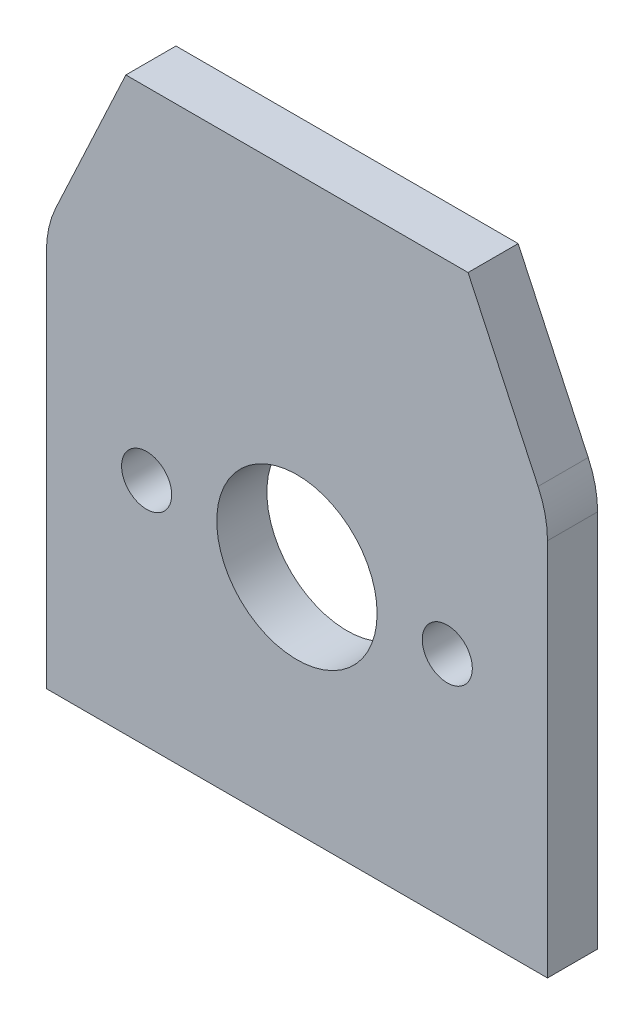
ISO-10303-21;
HEADER;
FILE_DESCRIPTION(('STEP AP214'),'2;1');
FILE_NAME('part.step','',(''),(''),'','','');
FILE_SCHEMA(('AUTOMOTIVE_DESIGN { 1 0 10303 214 1 1 1 1 }'));
ENDSEC;
DATA;
#1=APPLICATION_CONTEXT('core data for automotive mechanical design processes');
#2=APPLICATION_PROTOCOL_DEFINITION('international standard','automotive_design',2000,#1);
#3=PRODUCT_CONTEXT('',#1,'mechanical');
#4=PRODUCT('Part','Part','',(#3));
#5=PRODUCT_RELATED_PRODUCT_CATEGORY('part','',(#4));
#6=PRODUCT_DEFINITION_FORMATION('','',#4);
#7=PRODUCT_DEFINITION_CONTEXT('part definition',#1,'design');
#8=PRODUCT_DEFINITION('design','',#6,#7);
#9=PRODUCT_DEFINITION_SHAPE('','',#8);
#10=(LENGTH_UNIT() NAMED_UNIT(*) SI_UNIT(.MILLI.,.METRE.));
#11=(NAMED_UNIT(*) PLANE_ANGLE_UNIT() SI_UNIT($,.RADIAN.));
#12=(NAMED_UNIT(*) SI_UNIT($,.STERADIAN.) SOLID_ANGLE_UNIT());
#13=UNCERTAINTY_MEASURE_WITH_UNIT(LENGTH_MEASURE(1.E-05),#10,'distance_accuracy_value','');
#14=(GEOMETRIC_REPRESENTATION_CONTEXT(3) GLOBAL_UNCERTAINTY_ASSIGNED_CONTEXT((#13)) GLOBAL_UNIT_ASSIGNED_CONTEXT((#10,
#11,#12)) REPRESENTATION_CONTEXT('',''));
#15=CARTESIAN_POINT('',(0.,0.,0.));
#16=DIRECTION('',(0.,0.,1.));
#17=DIRECTION('',(1.,0.,0.));
#18=AXIS2_PLACEMENT_3D('',#15,#16,#17);
#19=CARTESIAN_POINT('',(15.,37.7830533735706,2.5));
#20=DIRECTION('',(0.,0.,1.));
#21=DIRECTION('',(1.,0.,0.));
#22=AXIS2_PLACEMENT_3D('',#19,#20,#21);
#23=PLANE('',#22);
#24=CARTESIAN_POINT('',(-15.,23.,2.5));
#25=DIRECTION('',(0.,0.,1.));
#26=DIRECTION('',(1.,0.,0.));
#27=AXIS2_PLACEMENT_3D('',#24,#25,#26);
#28=CIRCLE('',#27,2.5);
#29=CARTESIAN_POINT('',(-12.5,23.,2.5));
#30=VERTEX_POINT('',#29);
#31=EDGE_CURVE('E192',#30,#30,#28,.T.);
#32=ORIENTED_EDGE('',*,*,#31,.F.);
#33=EDGE_LOOP('',(#32));
#34=FACE_BOUND('',#33,.T.);
#35=DIRECTION('',(1.,0.,0.));
#36=VECTOR('',#35,1.);
#37=CARTESIAN_POINT('',(-25.,0.,2.5));
#38=LINE('',#37,#36);
#39=CARTESIAN_POINT('',(-25.,0.,2.5));
#40=VERTEX_POINT('',#39);
#41=CARTESIAN_POINT('',(25.,0.,2.5));
#42=VERTEX_POINT('',#41);
#43=EDGE_CURVE('E155',#40,#42,#38,.T.);
#44=ORIENTED_EDGE('',*,*,#43,.T.);
#45=DIRECTION('',(0.,1.,0.));
#46=VECTOR('',#45,1.);
#47=CARTESIAN_POINT('',(25.,0.,2.5));
#48=LINE('',#47,#46);
#49=CARTESIAN_POINT('',(25.,37.7830533735706,2.5));
#50=VERTEX_POINT('',#49);
#51=EDGE_CURVE('E103',#42,#50,#48,.T.);
#52=ORIENTED_EDGE('',*,*,#51,.T.);
#53=CARTESIAN_POINT('',(15.,37.7830533735706,2.5));
#54=DIRECTION('',(0.,0.,1.));
#55=DIRECTION('',(1.,0.,0.));
#56=AXIS2_PLACEMENT_3D('',#53,#54,#55);
#57=CIRCLE('',#56,10.);
#58=CARTESIAN_POINT('',(24.0630778703665,42.0092359909776,2.5));
#59=VERTEX_POINT('',#58);
#60=EDGE_CURVE('E170',#50,#59,#57,.T.);
#61=ORIENTED_EDGE('',*,*,#60,.T.);
#62=DIRECTION('',(-0.4226182617407,0.90630778703665,0.));
#63=VECTOR('',#62,1.);
#64=CARTESIAN_POINT('',(24.0630778703665,42.0092359909776,2.5));
#65=LINE('',#64,#63);
#66=CARTESIAN_POINT('',(17.072769811365,57.,2.5));
#67=VERTEX_POINT('',#66);
#68=EDGE_CURVE('E183',#59,#67,#65,.T.);
#69=ORIENTED_EDGE('',*,*,#68,.T.);
#70=DIRECTION('',(-1.,0.,0.));
#71=VECTOR('',#70,1.);
#72=CARTESIAN_POINT('',(-17.072769811365,57.,2.5));
#73=LINE('',#72,#71);
#74=CARTESIAN_POINT('',(-17.072769811365,57.,2.5));
#75=VERTEX_POINT('',#74);
#76=EDGE_CURVE('E122',#67,#75,#73,.T.);
#77=ORIENTED_EDGE('',*,*,#76,.T.);
#78=DIRECTION('',(-0.4226182617407,-0.90630778703665,0.));
#79=VECTOR('',#78,1.);
#80=CARTESIAN_POINT('',(-24.0630778703665,42.0092359909776,2.5));
#81=LINE('',#80,#79);
#82=CARTESIAN_POINT('',(-24.0630778703665,42.0092359909776,2.5));
#83=VERTEX_POINT('',#82);
#84=EDGE_CURVE('E116',#75,#83,#81,.T.);
#85=ORIENTED_EDGE('',*,*,#84,.T.);
#86=CARTESIAN_POINT('',(-15.,37.7830533735706,2.5));
#87=DIRECTION('',(0.,0.,1.));
#88=DIRECTION('',(-1.,0.,0.));
#89=AXIS2_PLACEMENT_3D('',#86,#87,#88);
#90=CIRCLE('',#89,10.);
#91=CARTESIAN_POINT('',(-25.,37.7830533735706,2.5));
#92=VERTEX_POINT('',#91);
#93=EDGE_CURVE('E120',#83,#92,#90,.T.);
#94=ORIENTED_EDGE('',*,*,#93,.T.);
#95=DIRECTION('',(0.,-1.,0.));
#96=VECTOR('',#95,1.);
#97=CARTESIAN_POINT('',(-25.,0.,2.5));
#98=LINE('',#97,#96);
#99=EDGE_CURVE('E60',#92,#40,#98,.T.);
#100=ORIENTED_EDGE('',*,*,#99,.T.);
#101=EDGE_LOOP('',(#44,#52,#61,#69,#77,#85,#94,#100));
#102=FACE_BOUND('',#101,.T.);
#103=CARTESIAN_POINT('',(0.,23.,2.5));
#104=DIRECTION('',(0.,0.,1.));
#105=DIRECTION('',(1.,0.,0.));
#106=AXIS2_PLACEMENT_3D('',#103,#104,#105);
#107=CIRCLE('',#106,8.);
#108=CARTESIAN_POINT('',(8.,23.,2.5));
#109=VERTEX_POINT('',#108);
#110=EDGE_CURVE('E144',#109,#109,#107,.T.);
#111=ORIENTED_EDGE('',*,*,#110,.F.);
#112=EDGE_LOOP('',(#111));
#113=FACE_BOUND('',#112,.T.);
#114=CARTESIAN_POINT('',(15.,23.,2.5));
#115=DIRECTION('',(0.,0.,1.));
#116=DIRECTION('',(1.,0.,0.));
#117=AXIS2_PLACEMENT_3D('',#114,#115,#116);
#118=CIRCLE('',#117,2.5);
#119=CARTESIAN_POINT('',(17.5,23.,2.5));
#120=VERTEX_POINT('',#119);
#121=EDGE_CURVE('E198',#120,#120,#118,.T.);
#122=ORIENTED_EDGE('',*,*,#121,.F.);
#123=EDGE_LOOP('',(#122));
#124=FACE_BOUND('',#123,.T.);
#125=ADVANCED_FACE('F43',(#34,#102,#113,#124),#23,.T.);
#126=CARTESIAN_POINT('',(15.,37.7830533735706,-2.5));
#127=DIRECTION('',(0.,0.,1.));
#128=DIRECTION('',(1.,0.,0.));
#129=AXIS2_PLACEMENT_3D('',#126,#127,#128);
#130=PLANE('',#129);
#131=DIRECTION('',(1.,0.,0.));
#132=VECTOR('',#131,1.);
#133=CARTESIAN_POINT('',(-25.,0.,-2.5));
#134=LINE('',#133,#132);
#135=CARTESIAN_POINT('',(-25.,0.,-2.5));
#136=VERTEX_POINT('',#135);
#137=CARTESIAN_POINT('',(25.,0.,-2.5));
#138=VERTEX_POINT('',#137);
#139=EDGE_CURVE('E140',#136,#138,#134,.T.);
#140=ORIENTED_EDGE('',*,*,#139,.F.);
#141=DIRECTION('',(0.,-1.,0.));
#142=VECTOR('',#141,1.);
#143=CARTESIAN_POINT('',(-25.,0.,-2.5));
#144=LINE('',#143,#142);
#145=CARTESIAN_POINT('',(-25.,37.7830533735706,-2.5));
#146=VERTEX_POINT('',#145);
#147=EDGE_CURVE('E95',#146,#136,#144,.T.);
#148=ORIENTED_EDGE('',*,*,#147,.F.);
#149=CARTESIAN_POINT('',(-15.,37.7830533735706,-2.5));
#150=DIRECTION('',(0.,0.,1.));
#151=DIRECTION('',(-1.,0.,0.));
#152=AXIS2_PLACEMENT_3D('',#149,#150,#151);
#153=CIRCLE('',#152,10.);
#154=CARTESIAN_POINT('',(-24.0630778703665,42.0092359909776,-2.5));
#155=VERTEX_POINT('',#154);
#156=EDGE_CURVE('E89',#155,#146,#153,.T.);
#157=ORIENTED_EDGE('',*,*,#156,.F.);
#158=DIRECTION('',(-0.4226182617407,-0.90630778703665,0.));
#159=VECTOR('',#158,1.);
#160=CARTESIAN_POINT('',(-24.0630778703665,42.0092359909776,-2.5));
#161=LINE('',#160,#159);
#162=CARTESIAN_POINT('',(-17.072769811365,57.,-2.5));
#163=VERTEX_POINT('',#162);
#164=EDGE_CURVE('E130',#163,#155,#161,.T.);
#165=ORIENTED_EDGE('',*,*,#164,.F.);
#166=DIRECTION('',(-1.,0.,0.));
#167=VECTOR('',#166,1.);
#168=CARTESIAN_POINT('',(-17.072769811365,57.,-2.5));
#169=LINE('',#168,#167);
#170=CARTESIAN_POINT('',(17.072769811365,57.,-2.5));
#171=VERTEX_POINT('',#170);
#172=EDGE_CURVE('E150',#171,#163,#169,.T.);
#173=ORIENTED_EDGE('',*,*,#172,.F.);
#174=DIRECTION('',(-0.4226182617407,0.90630778703665,0.));
#175=VECTOR('',#174,1.);
#176=CARTESIAN_POINT('',(24.0630778703665,42.0092359909776,-2.5));
#177=LINE('',#176,#175);
#178=CARTESIAN_POINT('',(24.0630778703665,42.0092359909776,-2.5));
#179=VERTEX_POINT('',#178);
#180=EDGE_CURVE('E148',#179,#171,#177,.T.);
#181=ORIENTED_EDGE('',*,*,#180,.F.);
#182=CARTESIAN_POINT('',(15.,37.7830533735706,-2.5));
#183=DIRECTION('',(0.,0.,1.));
#184=DIRECTION('',(1.,0.,0.));
#185=AXIS2_PLACEMENT_3D('',#182,#183,#184);
#186=CIRCLE('',#185,10.);
#187=CARTESIAN_POINT('',(25.,37.7830533735706,-2.5));
#188=VERTEX_POINT('',#187);
#189=EDGE_CURVE('E146',#188,#179,#186,.T.);
#190=ORIENTED_EDGE('',*,*,#189,.F.);
#191=DIRECTION('',(0.,1.,0.));
#192=VECTOR('',#191,1.);
#193=CARTESIAN_POINT('',(25.,0.,-2.5));
#194=LINE('',#193,#192);
#195=EDGE_CURVE('E143',#138,#188,#194,.T.);
#196=ORIENTED_EDGE('',*,*,#195,.F.);
#197=EDGE_LOOP('',(#140,#148,#157,#165,#173,#181,#190,#196));
#198=FACE_BOUND('',#197,.T.);
#199=CARTESIAN_POINT('',(0.,23.,-2.5));
#200=DIRECTION('',(0.,0.,1.));
#201=DIRECTION('',(1.,0.,0.));
#202=AXIS2_PLACEMENT_3D('',#199,#200,#201);
#203=CIRCLE('',#202,8.);
#204=CARTESIAN_POINT('',(8.,23.,-2.5));
#205=VERTEX_POINT('',#204);
#206=EDGE_CURVE('E189',#205,#205,#203,.T.);
#207=ORIENTED_EDGE('',*,*,#206,.T.);
#208=EDGE_LOOP('',(#207));
#209=FACE_BOUND('',#208,.T.);
#210=CARTESIAN_POINT('',(-15.,23.,-2.5));
#211=DIRECTION('',(0.,0.,1.));
#212=DIRECTION('',(1.,0.,0.));
#213=AXIS2_PLACEMENT_3D('',#210,#211,#212);
#214=CIRCLE('',#213,2.5);
#215=CARTESIAN_POINT('',(-12.5,23.,-2.5));
#216=VERTEX_POINT('',#215);
#217=EDGE_CURVE('E195',#216,#216,#214,.T.);
#218=ORIENTED_EDGE('',*,*,#217,.T.);
#219=EDGE_LOOP('',(#218));
#220=FACE_BOUND('',#219,.T.);
#221=CARTESIAN_POINT('',(15.,23.,-2.5));
#222=DIRECTION('',(0.,0.,1.));
#223=DIRECTION('',(1.,0.,0.));
#224=AXIS2_PLACEMENT_3D('',#221,#222,#223);
#225=CIRCLE('',#224,2.5);
#226=CARTESIAN_POINT('',(17.5,23.,-2.5));
#227=VERTEX_POINT('',#226);
#228=EDGE_CURVE('E201',#227,#227,#225,.T.);
#229=ORIENTED_EDGE('',*,*,#228,.T.);
#230=EDGE_LOOP('',(#229));
#231=FACE_BOUND('',#230,.T.);
#232=ADVANCED_FACE('F174',(#198,#209,#220,#231),#130,.F.);
#233=CARTESIAN_POINT('',(-25.,0.,2.5));
#234=DIRECTION('',(0.,1.,0.));
#235=DIRECTION('',(0.,0.,1.));
#236=AXIS2_PLACEMENT_3D('',#233,#234,#235);
#237=PLANE('',#236);
#238=ORIENTED_EDGE('',*,*,#139,.T.);
#239=DIRECTION('',(0.,0.,-1.));
#240=VECTOR('',#239,1.);
#241=CARTESIAN_POINT('',(25.,0.,2.5));
#242=LINE('',#241,#240);
#243=EDGE_CURVE('E11',#42,#138,#242,.T.);
#244=ORIENTED_EDGE('',*,*,#243,.F.);
#245=ORIENTED_EDGE('',*,*,#43,.F.);
#246=DIRECTION('',(0.,0.,-1.));
#247=VECTOR('',#246,1.);
#248=CARTESIAN_POINT('',(-25.,0.,2.5));
#249=LINE('',#248,#247);
#250=EDGE_CURVE('E136',#40,#136,#249,.T.);
#251=ORIENTED_EDGE('',*,*,#250,.T.);
#252=EDGE_LOOP('',(#238,#244,#245,#251));
#253=FACE_BOUND('',#252,.T.);
#254=ADVANCED_FACE('F45',(#253),#237,.F.);
#255=CARTESIAN_POINT('',(25.,0.,2.5));
#256=DIRECTION('',(-1.,0.,0.));
#257=DIRECTION('',(0.,-1.,0.));
#258=AXIS2_PLACEMENT_3D('',#255,#256,#257);
#259=PLANE('',#258);
#260=ORIENTED_EDGE('',*,*,#195,.T.);
#261=DIRECTION('',(0.,0.,-1.));
#262=VECTOR('',#261,1.);
#263=CARTESIAN_POINT('',(25.,37.7830533735706,2.5));
#264=LINE('',#263,#262);
#265=EDGE_CURVE('E52',#50,#188,#264,.T.);
#266=ORIENTED_EDGE('',*,*,#265,.F.);
#267=ORIENTED_EDGE('',*,*,#51,.F.);
#268=ORIENTED_EDGE('',*,*,#243,.T.);
#269=EDGE_LOOP('',(#260,#266,#267,#268));
#270=FACE_BOUND('',#269,.T.);
#271=ADVANCED_FACE('F234',(#270),#259,.F.);
#272=CARTESIAN_POINT('',(15.,37.7830533735706,2.5));
#273=DIRECTION('',(0.,0.,-1.));
#274=DIRECTION('',(-1.,0.,0.));
#275=AXIS2_PLACEMENT_3D('',#272,#273,#274);
#276=CYLINDRICAL_SURFACE('',#275,10.);
#277=ORIENTED_EDGE('',*,*,#189,.T.);
#278=DIRECTION('',(0.,0.,-1.));
#279=VECTOR('',#278,1.);
#280=CARTESIAN_POINT('',(24.0630778703665,42.0092359909776,2.5));
#281=LINE('',#280,#279);
#282=EDGE_CURVE('E162',#59,#179,#281,.T.);
#283=ORIENTED_EDGE('',*,*,#282,.F.);
#284=ORIENTED_EDGE('',*,*,#60,.F.);
#285=ORIENTED_EDGE('',*,*,#265,.T.);
#286=EDGE_LOOP('',(#277,#283,#284,#285));
#287=FACE_BOUND('',#286,.T.);
#288=ADVANCED_FACE('F168',(#287),#276,.T.);
#289=CARTESIAN_POINT('',(24.0630778703665,42.0092359909776,2.5));
#290=DIRECTION('',(-0.90630778703665,-0.4226182617407,0.));
#291=DIRECTION('',(0.4226182617407,-0.90630778703665,0.));
#292=AXIS2_PLACEMENT_3D('',#289,#290,#291);
#293=PLANE('',#292);
#294=ORIENTED_EDGE('',*,*,#180,.T.);
#295=DIRECTION('',(0.,0.,-1.));
#296=VECTOR('',#295,1.);
#297=CARTESIAN_POINT('',(17.072769811365,57.,2.5));
#298=LINE('',#297,#296);
#299=EDGE_CURVE('E159',#67,#171,#298,.T.);
#300=ORIENTED_EDGE('',*,*,#299,.F.);
#301=ORIENTED_EDGE('',*,*,#68,.F.);
#302=ORIENTED_EDGE('',*,*,#282,.T.);
#303=EDGE_LOOP('',(#294,#300,#301,#302));
#304=FACE_BOUND('',#303,.T.);
#305=ADVANCED_FACE('F179',(#304),#293,.F.);
#306=CARTESIAN_POINT('',(-17.072769811365,57.,2.5));
#307=DIRECTION('',(0.,-1.,0.));
#308=DIRECTION('',(0.,0.,-1.));
#309=AXIS2_PLACEMENT_3D('',#306,#307,#308);
#310=PLANE('',#309);
#311=ORIENTED_EDGE('',*,*,#172,.T.);
#312=DIRECTION('',(0.,0.,-1.));
#313=VECTOR('',#312,1.);
#314=CARTESIAN_POINT('',(-17.072769811365,57.,2.5));
#315=LINE('',#314,#313);
#316=EDGE_CURVE('E131',#75,#163,#315,.T.);
#317=ORIENTED_EDGE('',*,*,#316,.F.);
#318=ORIENTED_EDGE('',*,*,#76,.F.);
#319=ORIENTED_EDGE('',*,*,#299,.T.);
#320=EDGE_LOOP('',(#311,#317,#318,#319));
#321=FACE_BOUND('',#320,.T.);
#322=ADVANCED_FACE('F182',(#321),#310,.F.);
#323=CARTESIAN_POINT('',(-24.0630778703665,42.0092359909776,2.5));
#324=DIRECTION('',(0.90630778703665,-0.4226182617407,0.));
#325=DIRECTION('',(0.4226182617407,0.90630778703665,0.));
#326=AXIS2_PLACEMENT_3D('',#323,#324,#325);
#327=PLANE('',#326);
#328=ORIENTED_EDGE('',*,*,#164,.T.);
#329=DIRECTION('',(0.,0.,-1.));
#330=VECTOR('',#329,1.);
#331=CARTESIAN_POINT('',(-24.0630778703665,42.0092359909776,2.5));
#332=LINE('',#331,#330);
#333=EDGE_CURVE('E127',#83,#155,#332,.T.);
#334=ORIENTED_EDGE('',*,*,#333,.F.);
#335=ORIENTED_EDGE('',*,*,#84,.F.);
#336=ORIENTED_EDGE('',*,*,#316,.T.);
#337=EDGE_LOOP('',(#328,#334,#335,#336));
#338=FACE_BOUND('',#337,.T.);
#339=ADVANCED_FACE('F128',(#338),#327,.F.);
#340=CARTESIAN_POINT('',(-15.,37.7830533735706,2.5));
#341=DIRECTION('',(0.,0.,-1.));
#342=DIRECTION('',(-1.,0.,0.));
#343=AXIS2_PLACEMENT_3D('',#340,#341,#342);
#344=CYLINDRICAL_SURFACE('',#343,10.);
#345=ORIENTED_EDGE('',*,*,#156,.T.);
#346=DIRECTION('',(0.,0.,-1.));
#347=VECTOR('',#346,1.);
#348=CARTESIAN_POINT('',(-25.,37.7830533735706,2.5));
#349=LINE('',#348,#347);
#350=EDGE_CURVE('E132',#92,#146,#349,.T.);
#351=ORIENTED_EDGE('',*,*,#350,.F.);
#352=ORIENTED_EDGE('',*,*,#93,.F.);
#353=ORIENTED_EDGE('',*,*,#333,.T.);
#354=EDGE_LOOP('',(#345,#351,#352,#353));
#355=FACE_BOUND('',#354,.T.);
#356=ADVANCED_FACE('F134',(#355),#344,.T.);
#357=CARTESIAN_POINT('',(-25.,0.,2.5));
#358=DIRECTION('',(1.,0.,0.));
#359=DIRECTION('',(0.,1.,0.));
#360=AXIS2_PLACEMENT_3D('',#357,#358,#359);
#361=PLANE('',#360);
#362=ORIENTED_EDGE('',*,*,#147,.T.);
#363=ORIENTED_EDGE('',*,*,#250,.F.);
#364=ORIENTED_EDGE('',*,*,#99,.F.);
#365=ORIENTED_EDGE('',*,*,#350,.T.);
#366=EDGE_LOOP('',(#362,#363,#364,#365));
#367=FACE_BOUND('',#366,.T.);
#368=ADVANCED_FACE('F222',(#367),#361,.F.);
#369=CARTESIAN_POINT('',(0.,23.,2.5));
#370=DIRECTION('',(0.,0.,-1.));
#371=DIRECTION('',(-1.,0.,0.));
#372=AXIS2_PLACEMENT_3D('',#369,#370,#371);
#373=CYLINDRICAL_SURFACE('',#372,8.);
#374=ORIENTED_EDGE('',*,*,#110,.T.);
#375=EDGE_LOOP('',(#374));
#376=FACE_BOUND('',#375,.T.);
#377=ORIENTED_EDGE('',*,*,#206,.F.);
#378=EDGE_LOOP('',(#377));
#379=FACE_BOUND('',#378,.T.);
#380=ADVANCED_FACE('F219',(#376,#379),#373,.F.);
#381=CARTESIAN_POINT('',(-15.,23.,2.5));
#382=DIRECTION('',(0.,0.,-1.));
#383=DIRECTION('',(-1.,0.,0.));
#384=AXIS2_PLACEMENT_3D('',#381,#382,#383);
#385=CYLINDRICAL_SURFACE('',#384,2.5);
#386=ORIENTED_EDGE('',*,*,#31,.T.);
#387=EDGE_LOOP('',(#386));
#388=FACE_BOUND('',#387,.T.);
#389=ORIENTED_EDGE('',*,*,#217,.F.);
#390=EDGE_LOOP('',(#389));
#391=FACE_BOUND('',#390,.T.);
#392=ADVANCED_FACE('F297',(#388,#391),#385,.F.);
#393=CARTESIAN_POINT('',(15.,23.,2.5));
#394=DIRECTION('',(0.,0.,-1.));
#395=DIRECTION('',(-1.,0.,0.));
#396=AXIS2_PLACEMENT_3D('',#393,#394,#395);
#397=CYLINDRICAL_SURFACE('',#396,2.5);
#398=ORIENTED_EDGE('',*,*,#121,.T.);
#399=EDGE_LOOP('',(#398));
#400=FACE_BOUND('',#399,.T.);
#401=ORIENTED_EDGE('',*,*,#228,.F.);
#402=EDGE_LOOP('',(#401));
#403=FACE_BOUND('',#402,.T.);
#404=ADVANCED_FACE('F207',(#400,#403),#397,.F.);
#405=CLOSED_SHELL('',(#125,#232,#254,#271,#288,#305,#322,#339,#356,#368,#380,#392,#404));
#406=MANIFOLD_SOLID_BREP('B2',#405);
#407=ADVANCED_BREP_SHAPE_REPRESENTATION('',(#18,#406),#14);
#408=SHAPE_DEFINITION_REPRESENTATION(#9,#407);
ENDSEC;
END-ISO-10303-21;
